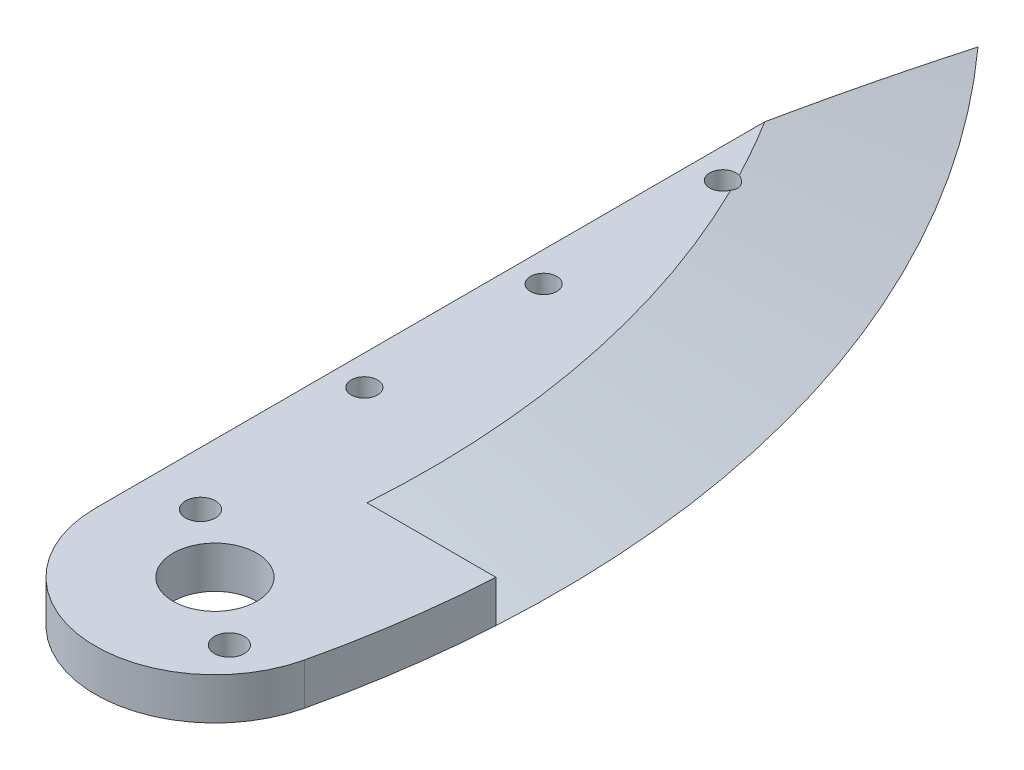
ISO-10303-21;
HEADER;
FILE_DESCRIPTION(('STEP AP214'),'2;1');
FILE_NAME('part.step','',(''),(''),'','','');
FILE_SCHEMA(('AUTOMOTIVE_DESIGN { 1 0 10303 214 1 1 1 1 }'));
ENDSEC;
DATA;
#1=APPLICATION_CONTEXT('core data for automotive mechanical design processes');
#2=APPLICATION_PROTOCOL_DEFINITION('international standard','automotive_design',2000,#1);
#3=PRODUCT_CONTEXT('',#1,'mechanical');
#4=PRODUCT('Part','Part','',(#3));
#5=PRODUCT_RELATED_PRODUCT_CATEGORY('part','',(#4));
#6=PRODUCT_DEFINITION_FORMATION('','',#4);
#7=PRODUCT_DEFINITION_CONTEXT('part definition',#1,'design');
#8=PRODUCT_DEFINITION('design','',#6,#7);
#9=PRODUCT_DEFINITION_SHAPE('','',#8);
#10=(LENGTH_UNIT() NAMED_UNIT(*) SI_UNIT(.MILLI.,.METRE.));
#11=(NAMED_UNIT(*) PLANE_ANGLE_UNIT() SI_UNIT($,.RADIAN.));
#12=(NAMED_UNIT(*) SI_UNIT($,.STERADIAN.) SOLID_ANGLE_UNIT());
#13=UNCERTAINTY_MEASURE_WITH_UNIT(LENGTH_MEASURE(1.E-05),#10,'distance_accuracy_value','');
#14=(GEOMETRIC_REPRESENTATION_CONTEXT(3) GLOBAL_UNCERTAINTY_ASSIGNED_CONTEXT((#13)) GLOBAL_UNIT_ASSIGNED_CONTEXT((#10,
#11,#12)) REPRESENTATION_CONTEXT('',''));
#15=CARTESIAN_POINT('',(0.,0.,0.));
#16=DIRECTION('',(0.,0.,1.));
#17=DIRECTION('',(1.,0.,0.));
#18=AXIS2_PLACEMENT_3D('',#15,#16,#17);
#19=CARTESIAN_POINT('',(-7.5,0.,-20.));
#20=DIRECTION('',(0.,1.,0.));
#21=DIRECTION('',(0.,0.,1.));
#22=AXIS2_PLACEMENT_3D('',#19,#20,#21);
#23=CYLINDRICAL_SURFACE('',#22,1.1);
#24=CARTESIAN_POINT('',(-7.5,0.,-20.));
#25=DIRECTION('',(0.,1.,0.));
#26=DIRECTION('',(0.,0.,1.));
#27=AXIS2_PLACEMENT_3D('',#24,#25,#26);
#28=CIRCLE('',#27,1.1);
#29=CARTESIAN_POINT('',(-7.5,0.,-18.9));
#30=VERTEX_POINT('',#29);
#31=EDGE_CURVE('E109',#30,#30,#28,.T.);
#32=ORIENTED_EDGE('',*,*,#31,.F.);
#33=EDGE_LOOP('',(#32));
#34=FACE_BOUND('',#33,.T.);
#35=CARTESIAN_POINT('',(-7.5,3.5,-20.));
#36=DIRECTION('',(0.,1.,0.));
#37=DIRECTION('',(0.,0.,1.));
#38=AXIS2_PLACEMENT_3D('',#35,#36,#37);
#39=CIRCLE('',#38,1.1);
#40=CARTESIAN_POINT('',(-7.5,3.5,-18.9));
#41=VERTEX_POINT('',#40);
#42=EDGE_CURVE('E148',#41,#41,#39,.T.);
#43=ORIENTED_EDGE('',*,*,#42,.T.);
#44=EDGE_LOOP('',(#43));
#45=FACE_BOUND('',#44,.T.);
#46=ADVANCED_FACE('F16',(#34,#45),#23,.F.);
#47=CARTESIAN_POINT('',(-7.5,0.,-35.));
#48=DIRECTION('',(0.,1.,0.));
#49=DIRECTION('',(0.,0.,1.));
#50=AXIS2_PLACEMENT_3D('',#47,#48,#49);
#51=CYLINDRICAL_SURFACE('',#50,1.1);
#52=CARTESIAN_POINT('',(-7.5,0.,-35.));
#53=DIRECTION('',(0.,1.,0.));
#54=DIRECTION('',(0.,0.,1.));
#55=AXIS2_PLACEMENT_3D('',#52,#53,#54);
#56=CIRCLE('',#55,1.1);
#57=CARTESIAN_POINT('',(-7.5,0.,-33.9));
#58=VERTEX_POINT('',#57);
#59=EDGE_CURVE('E170',#58,#58,#56,.T.);
#60=ORIENTED_EDGE('',*,*,#59,.F.);
#61=EDGE_LOOP('',(#60));
#62=FACE_BOUND('',#61,.T.);
#63=CARTESIAN_POINT('',(-7.5,3.5,-35.));
#64=DIRECTION('',(0.,1.,0.));
#65=DIRECTION('',(0.,0.,1.));
#66=AXIS2_PLACEMENT_3D('',#63,#64,#65);
#67=CIRCLE('',#66,1.1);
#68=CARTESIAN_POINT('',(-7.5,3.5,-33.9));
#69=VERTEX_POINT('',#68);
#70=EDGE_CURVE('E152',#69,#69,#67,.T.);
#71=ORIENTED_EDGE('',*,*,#70,.T.);
#72=EDGE_LOOP('',(#71));
#73=FACE_BOUND('',#72,.T.);
#74=ADVANCED_FACE('F220',(#62,#73),#51,.F.);
#75=CARTESIAN_POINT('',(-7.5,0.,-50.));
#76=DIRECTION('',(0.,1.,0.));
#77=DIRECTION('',(0.,0.,1.));
#78=AXIS2_PLACEMENT_3D('',#75,#76,#77);
#79=CYLINDRICAL_SURFACE('',#78,1.1);
#80=CARTESIAN_POINT('',(-6.46631187235693,3.49999999999992,-49.6238499571052));
#81=CARTESIAN_POINT('',(-6.45607062410141,3.49297877634061,-49.6519948755355));
#82=CARTESIAN_POINT('',(-6.44696231958127,3.48621857799535,-49.6806036607564));
#83=CARTESIAN_POINT('',(-6.43108839688875,3.47326332392636,-49.7385941021761));
#84=CARTESIAN_POINT('',(-6.42432319816683,3.46706836953566,-49.7679758957428));
#85=CARTESIAN_POINT('',(-6.40766510359482,3.44940252996874,-49.8570186176896));
#86=CARTESIAN_POINT('',(-6.40140466748316,3.4388472208493,-49.9175906902652));
#87=CARTESIAN_POINT('',(-6.39901507298767,3.42054524776643,-50.0394360130987));
#88=CARTESIAN_POINT('',(-6.40290193563018,3.41280304724679,-50.1007102199038));
#89=CARTESIAN_POINT('',(-6.42090033472022,3.40042385722411,-50.2220334059956));
#90=CARTESIAN_POINT('',(-6.43500460177031,3.39578466452872,-50.2820832251868));
#91=CARTESIAN_POINT('',(-6.47258785991137,3.38986229654186,-50.3975001179258));
#92=CARTESIAN_POINT('',(-6.4957963244886,3.38848971166973,-50.4529508311856));
#93=CARTESIAN_POINT('',(-6.55092410160917,3.38888698941554,-50.5593232948815));
#94=CARTESIAN_POINT('',(-6.58284270359912,3.39065659576542,-50.6102454143009));
#95=CARTESIAN_POINT('',(-6.65384420105782,3.39722098480096,-50.705325879994));
#96=CARTESIAN_POINT('',(-6.69280454351501,3.40196700458968,-50.7495792556829));
#97=CARTESIAN_POINT('',(-6.77705782729283,3.41427764176864,-50.8311417314869));
#98=CARTESIAN_POINT('',(-6.82235409683536,3.42184374403,-50.8684471577196));
#99=CARTESIAN_POINT('',(-6.91915588273286,3.43977642948853,-50.9360485484778));
#100=CARTESIAN_POINT('',(-6.97078759945537,3.45020785404511,-50.9661475773246));
#101=CARTESIAN_POINT('',(-7.05097066738159,3.46761854255056,-51.0046171503729));
#102=CARTESIAN_POINT('',(-7.07816203634793,3.47371792875002,-51.0163294548428));
#103=CARTESIAN_POINT('',(-7.1332818636862,3.48646103386444,-51.0374911988863));
#104=CARTESIAN_POINT('',(-7.1612101806697,3.49310464887283,-51.0469410690686));
#105=CARTESIAN_POINT('',(-7.1894267575076,3.49999999999993,-51.0552460665872));
#106=B_SPLINE_CURVE_WITH_KNOTS('',3,(#80,#81,#82,#83,#84,#85,#86,#87,#88,#89,#90,#91,#92,#93,
#94,#95,#96,#97,#98,#99,#100,#101,#102,#103,#104,#105),.UNSPECIFIED.,.F.,.F.,(4,2,2,2,2,2,2,2,2,
2,2,2,4),(0.,0.092235318165596,0.184487139287674,0.368946055930047,0.553696380936295,
0.738315390188104,0.917820005798431,1.09730998220209,1.27393353228807,1.45065021246979,
1.63175259158328,1.72235305391589,1.81293625854403),.UNSPECIFIED.);
#107=CARTESIAN_POINT('',(-6.466311872357,3.5,-49.623849957105));
#108=VERTEX_POINT('',#107);
#109=CARTESIAN_POINT('',(-7.18942675750774,3.5,-51.0552460665873));
#110=VERTEX_POINT('',#109);
#111=EDGE_CURVE('E19',#108,#110,#106,.T.);
#112=ORIENTED_EDGE('',*,*,#111,.T.);
#113=CARTESIAN_POINT('',(-7.5,3.5,-50.));
#114=DIRECTION('',(0.,1.,0.));
#115=DIRECTION('',(0.,0.,1.));
#116=AXIS2_PLACEMENT_3D('',#113,#114,#115);
#117=CIRCLE('',#116,1.1);
#118=EDGE_CURVE('E68',#110,#108,#117,.T.);
#119=ORIENTED_EDGE('',*,*,#118,.T.);
#120=EDGE_LOOP('',(#112,#119));
#121=FACE_BOUND('',#120,.T.);
#122=CARTESIAN_POINT('',(-7.5,0.,-50.));
#123=DIRECTION('',(0.,1.,0.));
#124=DIRECTION('',(0.,0.,1.));
#125=AXIS2_PLACEMENT_3D('',#122,#123,#124);
#126=CIRCLE('',#125,1.1);
#127=CARTESIAN_POINT('',(-7.5,0.,-48.9));
#128=VERTEX_POINT('',#127);
#129=EDGE_CURVE('E174',#128,#128,#126,.T.);
#130=ORIENTED_EDGE('',*,*,#129,.F.);
#131=EDGE_LOOP('',(#130));
#132=FACE_BOUND('',#131,.T.);
#133=ADVANCED_FACE('F223',(#121,#132),#79,.F.);
#134=CARTESIAN_POINT('',(0.,0.,0.));
#135=DIRECTION('',(0.,1.,0.));
#136=DIRECTION('',(0.,0.,1.));
#137=AXIS2_PLACEMENT_3D('',#134,#135,#136);
#138=CYLINDRICAL_SURFACE('',#137,3.5);
#139=CARTESIAN_POINT('',(0.,0.,0.));
#140=DIRECTION('',(0.,1.,0.));
#141=DIRECTION('',(0.,0.,1.));
#142=AXIS2_PLACEMENT_3D('',#139,#140,#141);
#143=CIRCLE('',#142,3.5);
#144=CARTESIAN_POINT('',(0.,0.,3.5));
#145=VERTEX_POINT('',#144);
#146=EDGE_CURVE('E31',#145,#145,#143,.T.);
#147=ORIENTED_EDGE('',*,*,#146,.F.);
#148=EDGE_LOOP('',(#147));
#149=FACE_BOUND('',#148,.T.);
#150=CARTESIAN_POINT('',(0.,3.5,0.));
#151=DIRECTION('',(0.,1.,0.));
#152=DIRECTION('',(0.,0.,1.));
#153=AXIS2_PLACEMENT_3D('',#150,#151,#152);
#154=CIRCLE('',#153,3.5);
#155=CARTESIAN_POINT('',(0.,3.5,3.5));
#156=VERTEX_POINT('',#155);
#157=EDGE_CURVE('E156',#156,#156,#154,.T.);
#158=ORIENTED_EDGE('',*,*,#157,.T.);
#159=EDGE_LOOP('',(#158));
#160=FACE_BOUND('',#159,.T.);
#161=ADVANCED_FACE('F234',(#149,#160),#138,.F.);
#162=CARTESIAN_POINT('',(0.,0.,-11.75));
#163=DIRECTION('',(0.,0.,1.));
#164=DIRECTION('',(1.,0.,0.));
#165=AXIS2_PLACEMENT_3D('',#162,#163,#164);
#166=PLANE('',#165);
#167=CARTESIAN_POINT('',(0.97347031211252,3.5,-11.75));
#168=CARTESIAN_POINT('',(4.57169122132087,2.33365314944628,-11.75));
#169=CARTESIAN_POINT('',(8.16979555651049,1.16694591150477,-11.75));
#170=CARTESIAN_POINT('',(11.76782244775,0.,-11.75));
#171=B_SPLINE_CURVE_WITH_KNOTS('',3,(#167,#168,#169,#170),.UNSPECIFIED.,.F.,.F.,(4,4),
(0.0347062337489441,0.0460538327237267),.UNSPECIFIED.);
#172=CARTESIAN_POINT('',(0.97347031211252,3.5,-11.75));
#173=VERTEX_POINT('',#172);
#174=CARTESIAN_POINT('',(11.76782244775,0.,-11.75));
#175=VERTEX_POINT('',#174);
#176=EDGE_CURVE('E192',#173,#175,#171,.T.);
#177=ORIENTED_EDGE('',*,*,#176,.F.);
#178=DIRECTION('',(1.,0.,0.));
#179=VECTOR('',#178,1.);
#180=CARTESIAN_POINT('',(0.,3.5,-11.75));
#181=LINE('',#180,#179);
#182=CARTESIAN_POINT('',(11.76782244775,3.5,-11.75));
#183=VERTEX_POINT('',#182);
#184=EDGE_CURVE('E83',#173,#183,#181,.T.);
#185=ORIENTED_EDGE('',*,*,#184,.T.);
#186=DIRECTION('',(0.,1.,0.));
#187=VECTOR('',#186,1.);
#188=CARTESIAN_POINT('',(11.76782244775,0.,-11.75));
#189=LINE('',#188,#187);
#190=EDGE_CURVE('E10',#175,#183,#189,.T.);
#191=ORIENTED_EDGE('',*,*,#190,.F.);
#192=EDGE_LOOP('',(#177,#185,#191));
#193=FACE_BOUND('',#192,.T.);
#194=ADVANCED_FACE('F226',(#193),#166,.F.);
#195=CARTESIAN_POINT('',(-73.0777548588926,0.,-16.8713290757901));
#196=DIRECTION('',(0.,1.,0.));
#197=DIRECTION('',(0.,0.,1.));
#198=AXIS2_PLACEMENT_3D('',#195,#196,#197);
#199=CYLINDRICAL_SURFACE('',#198,85.);
#200=CARTESIAN_POINT('',(-73.0777548588926,3.5,-16.8713290757901));
#201=DIRECTION('',(0.,1.,0.));
#202=DIRECTION('',(0.,0.,1.));
#203=AXIS2_PLACEMENT_3D('',#200,#201,#202);
#204=CIRCLE('',#203,85.);
#205=CARTESIAN_POINT('',(9.74370064785234,3.5,2.24951054343868));
#206=VERTEX_POINT('',#205);
#207=EDGE_CURVE('E115',#206,#183,#204,.T.);
#208=ORIENTED_EDGE('',*,*,#207,.F.);
#209=DIRECTION('',(0.,1.,0.));
#210=VECTOR('',#209,1.);
#211=CARTESIAN_POINT('',(9.74370064785234,0.,2.24951054343868));
#212=LINE('',#211,#210);
#213=CARTESIAN_POINT('',(9.74370064785234,0.,2.24951054343868));
#214=VERTEX_POINT('',#213);
#215=EDGE_CURVE('E113',#214,#206,#212,.T.);
#216=ORIENTED_EDGE('',*,*,#215,.F.);
#217=CARTESIAN_POINT('',(-73.0777548588926,0.,-16.8713290757901));
#218=DIRECTION('',(0.,1.,0.));
#219=DIRECTION('',(0.,0.,1.));
#220=AXIS2_PLACEMENT_3D('',#217,#218,#219);
#221=CIRCLE('',#220,85.);
#222=EDGE_CURVE('E99',#214,#175,#221,.T.);
#223=ORIENTED_EDGE('',*,*,#222,.T.);
#224=ORIENTED_EDGE('',*,*,#190,.T.);
#225=EDGE_LOOP('',(#208,#216,#223,#224));
#226=FACE_BOUND('',#225,.T.);
#227=ADVANCED_FACE('F114',(#226),#199,.T.);
#228=CARTESIAN_POINT('',(0.,0.,0.));
#229=DIRECTION('',(0.,1.,0.));
#230=DIRECTION('',(1.,0.,0.));
#231=AXIS2_PLACEMENT_3D('',#228,#229,#230);
#232=PLANE('',#231);
#233=CARTESIAN_POINT('',(5.51607527524703,0.,4.30963032727963));
#234=DIRECTION('',(0.,1.,0.));
#235=DIRECTION('',(0.,0.,1.));
#236=AXIS2_PLACEMENT_3D('',#233,#234,#235);
#237=CIRCLE('',#236,1.25);
#238=CARTESIAN_POINT('',(5.51607527524703,0.,5.55963032727963));
#239=VERTEX_POINT('',#238);
#240=EDGE_CURVE('E134',#239,#239,#237,.T.);
#241=ORIENTED_EDGE('',*,*,#240,.T.);
#242=EDGE_LOOP('',(#241));
#243=FACE_BOUND('',#242,.T.);
#244=CARTESIAN_POINT('',(-5.51607527524703,0.,-4.30963032727963));
#245=DIRECTION('',(0.,1.,0.));
#246=DIRECTION('',(0.,0.,1.));
#247=AXIS2_PLACEMENT_3D('',#244,#245,#246);
#248=CIRCLE('',#247,1.25);
#249=CARTESIAN_POINT('',(-5.51607527524703,0.,-3.05963032727963));
#250=VERTEX_POINT('',#249);
#251=EDGE_CURVE('E110',#250,#250,#248,.T.);
#252=ORIENTED_EDGE('',*,*,#251,.T.);
#253=EDGE_LOOP('',(#252));
#254=FACE_BOUND('',#253,.T.);
#255=ORIENTED_EDGE('',*,*,#146,.T.);
#256=EDGE_LOOP('',(#255));
#257=FACE_BOUND('',#256,.T.);
#258=ORIENTED_EDGE('',*,*,#129,.T.);
#259=EDGE_LOOP('',(#258));
#260=FACE_BOUND('',#259,.T.);
#261=ORIENTED_EDGE('',*,*,#59,.T.);
#262=EDGE_LOOP('',(#261));
#263=FACE_BOUND('',#262,.T.);
#264=ORIENTED_EDGE('',*,*,#31,.T.);
#265=EDGE_LOOP('',(#264));
#266=FACE_BOUND('',#265,.T.);
#267=DIRECTION('',(0.,0.,-1.));
#268=VECTOR('',#267,1.);
#269=CARTESIAN_POINT('',(-10.,0.,0.));
#270=LINE('',#269,#268);
#271=CARTESIAN_POINT('',(-10.,0.,0.));
#272=VERTEX_POINT('',#271);
#273=CARTESIAN_POINT('',(-9.99999999999999,0.,-73.8467346641793));
#274=VERTEX_POINT('',#273);
#275=EDGE_CURVE('E131',#272,#274,#270,.T.);
#276=ORIENTED_EDGE('',*,*,#275,.T.);
#277=CARTESIAN_POINT('',(-73.0777548588926,0.,-16.8713290757901));
#278=DIRECTION('',(0.,1.,0.));
#279=DIRECTION('',(0.,0.,1.));
#280=AXIS2_PLACEMENT_3D('',#277,#278,#279);
#281=CIRCLE('',#280,85.);
#282=EDGE_CURVE('E106',#175,#274,#281,.T.);
#283=ORIENTED_EDGE('',*,*,#282,.F.);
#284=ORIENTED_EDGE('',*,*,#222,.F.);
#285=CARTESIAN_POINT('',(0.,0.,0.));
#286=DIRECTION('',(0.,1.,0.));
#287=DIRECTION('',(0.,0.,1.));
#288=AXIS2_PLACEMENT_3D('',#285,#286,#287);
#289=CIRCLE('',#288,10.);
#290=EDGE_CURVE('E103',#272,#214,#289,.T.);
#291=ORIENTED_EDGE('',*,*,#290,.F.);
#292=EDGE_LOOP('',(#276,#283,#284,#291));
#293=FACE_BOUND('',#292,.T.);
#294=ADVANCED_FACE('F101',(#243,#254,#257,#260,#263,#266,#293),#232,.F.);
#295=CARTESIAN_POINT('',(-5.51607527524703,3.5,-4.30963032727963));
#296=DIRECTION('',(0.,-1.,0.));
#297=DIRECTION('',(0.,0.,-1.));
#298=AXIS2_PLACEMENT_3D('',#295,#296,#297);
#299=CYLINDRICAL_SURFACE('',#298,1.25);
#300=CARTESIAN_POINT('',(-5.51607527524703,3.5,-4.30963032727963));
#301=DIRECTION('',(0.,1.,0.));
#302=DIRECTION('',(0.,0.,1.));
#303=AXIS2_PLACEMENT_3D('',#300,#301,#302);
#304=CIRCLE('',#303,1.25);
#305=CARTESIAN_POINT('',(-5.51607527524703,3.5,-3.05963032727963));
#306=VERTEX_POINT('',#305);
#307=EDGE_CURVE('E160',#306,#306,#304,.T.);
#308=ORIENTED_EDGE('',*,*,#307,.T.);
#309=EDGE_LOOP('',(#308));
#310=FACE_BOUND('',#309,.T.);
#311=ORIENTED_EDGE('',*,*,#251,.F.);
#312=EDGE_LOOP('',(#311));
#313=FACE_BOUND('',#312,.T.);
#314=ADVANCED_FACE('F232',(#310,#313),#299,.F.);
#315=CARTESIAN_POINT('',(0.,3.5,0.));
#316=DIRECTION('',(0.,1.,0.));
#317=DIRECTION('',(1.,0.,0.));
#318=AXIS2_PLACEMENT_3D('',#315,#316,#317);
#319=PLANE('',#318);
#320=CARTESIAN_POINT('',(5.51607527524703,3.5,4.30963032727963));
#321=DIRECTION('',(0.,1.,0.));
#322=DIRECTION('',(0.,0.,1.));
#323=AXIS2_PLACEMENT_3D('',#320,#321,#322);
#324=CIRCLE('',#323,1.25);
#325=CARTESIAN_POINT('',(5.51607527524703,3.5,5.55963032727963));
#326=VERTEX_POINT('',#325);
#327=EDGE_CURVE('E138',#326,#326,#324,.T.);
#328=ORIENTED_EDGE('',*,*,#327,.F.);
#329=EDGE_LOOP('',(#328));
#330=FACE_BOUND('',#329,.T.);
#331=ORIENTED_EDGE('',*,*,#307,.F.);
#332=EDGE_LOOP('',(#331));
#333=FACE_BOUND('',#332,.T.);
#334=ORIENTED_EDGE('',*,*,#157,.F.);
#335=EDGE_LOOP('',(#334));
#336=FACE_BOUND('',#335,.T.);
#337=ORIENTED_EDGE('',*,*,#70,.F.);
#338=EDGE_LOOP('',(#337));
#339=FACE_BOUND('',#338,.T.);
#340=ORIENTED_EDGE('',*,*,#42,.F.);
#341=EDGE_LOOP('',(#340));
#342=FACE_BOUND('',#341,.T.);
#343=ORIENTED_EDGE('',*,*,#118,.F.);
#344=CARTESIAN_POINT('',(-73.0777548588926,3.5,-16.8713290757901));
#345=DIRECTION('',(0.,1.,0.));
#346=DIRECTION('',(0.,0.,1.));
#347=AXIS2_PLACEMENT_3D('',#344,#345,#346);
#348=CIRCLE('',#347,74.2281076198864);
#349=CARTESIAN_POINT('',(-9.99999999999999,3.5,-55.9994366557752));
#350=VERTEX_POINT('',#349);
#351=EDGE_CURVE('E184',#110,#350,#348,.T.);
#352=ORIENTED_EDGE('',*,*,#351,.T.);
#353=DIRECTION('',(0.,0.,-1.));
#354=VECTOR('',#353,1.);
#355=CARTESIAN_POINT('',(-10.,3.5,0.));
#356=LINE('',#355,#354);
#357=CARTESIAN_POINT('',(-10.,3.5,0.));
#358=VERTEX_POINT('',#357);
#359=EDGE_CURVE('E181',#358,#350,#356,.T.);
#360=ORIENTED_EDGE('',*,*,#359,.F.);
#361=CARTESIAN_POINT('',(0.,3.5,0.));
#362=DIRECTION('',(0.,1.,0.));
#363=DIRECTION('',(0.,0.,1.));
#364=AXIS2_PLACEMENT_3D('',#361,#362,#363);
#365=CIRCLE('',#364,10.);
#366=EDGE_CURVE('E119',#358,#206,#365,.T.);
#367=ORIENTED_EDGE('',*,*,#366,.T.);
#368=ORIENTED_EDGE('',*,*,#207,.T.);
#369=ORIENTED_EDGE('',*,*,#184,.F.);
#370=CARTESIAN_POINT('',(-73.0777548588926,3.5,-16.8713290757901));
#371=DIRECTION('',(0.,1.,0.));
#372=DIRECTION('',(0.,0.,1.));
#373=AXIS2_PLACEMENT_3D('',#370,#371,#372);
#374=CIRCLE('',#373,74.2281076198864);
#375=EDGE_CURVE('E195',#173,#108,#374,.T.);
#376=ORIENTED_EDGE('',*,*,#375,.T.);
#377=EDGE_LOOP('',(#343,#352,#360,#367,#368,#369,#376));
#378=FACE_BOUND('',#377,.T.);
#379=ADVANCED_FACE('F245',(#330,#333,#336,#339,#342,#378),#319,.T.);
#380=CARTESIAN_POINT('',(5.51607527524703,3.5,4.30963032727963));
#381=DIRECTION('',(0.,-1.,0.));
#382=DIRECTION('',(0.,0.,-1.));
#383=AXIS2_PLACEMENT_3D('',#380,#381,#382);
#384=CYLINDRICAL_SURFACE('',#383,1.25);
#385=ORIENTED_EDGE('',*,*,#240,.F.);
#386=EDGE_LOOP('',(#385));
#387=FACE_BOUND('',#386,.T.);
#388=ORIENTED_EDGE('',*,*,#327,.T.);
#389=EDGE_LOOP('',(#388));
#390=FACE_BOUND('',#389,.T.);
#391=ADVANCED_FACE('F247',(#387,#390),#384,.F.);
#392=CARTESIAN_POINT('',(0.,3.5,0.));
#393=DIRECTION('',(0.,-1.,0.));
#394=DIRECTION('',(0.,0.,-1.));
#395=AXIS2_PLACEMENT_3D('',#392,#393,#394);
#396=CYLINDRICAL_SURFACE('',#395,10.);
#397=ORIENTED_EDGE('',*,*,#290,.T.);
#398=ORIENTED_EDGE('',*,*,#215,.T.);
#399=ORIENTED_EDGE('',*,*,#366,.F.);
#400=DIRECTION('',(0.,-1.,0.));
#401=VECTOR('',#400,1.);
#402=CARTESIAN_POINT('',(-10.,3.5,0.));
#403=LINE('',#402,#401);
#404=EDGE_CURVE('E123',#358,#272,#403,.T.);
#405=ORIENTED_EDGE('',*,*,#404,.T.);
#406=EDGE_LOOP('',(#397,#398,#399,#405));
#407=FACE_BOUND('',#406,.T.);
#408=ADVANCED_FACE('F121',(#407),#396,.T.);
#409=CARTESIAN_POINT('',(-10.,3.5,0.));
#410=DIRECTION('',(-1.,0.,0.));
#411=DIRECTION('',(0.,0.,1.));
#412=AXIS2_PLACEMENT_3D('',#409,#410,#411);
#413=PLANE('',#412);
#414=ORIENTED_EDGE('',*,*,#359,.T.);
#415=CARTESIAN_POINT('',(-10.,3.49999999999999,-55.9994366557752));
#416=CARTESIAN_POINT('',(-10.,3.24407147972871,-57.4935356108701));
#417=CARTESIAN_POINT('',(-10.,2.97791301738732,-58.9858554355272));
#418=CARTESIAN_POINT('',(-10.,2.4271369469217,-61.9668960592866));
#419=CARTESIAN_POINT('',(-9.99999999999999,2.14252164977348,-63.4556172848494));
#420=CARTESIAN_POINT('',(-9.99999999999999,1.55677463736293,-66.4297580737208));
#421=CARTESIAN_POINT('',(-9.99999999999999,1.25564331355606,-67.9151777144146));
#422=CARTESIAN_POINT('',(-9.99999999999999,0.638527511321968,-70.8831249329819));
#423=CARTESIAN_POINT('',(-9.99999999999999,0.322541181983983,-72.3656521263649));
#424=CARTESIAN_POINT('',(-9.99999999999999,0.,-73.8467346641793));
#425=B_SPLINE_CURVE_WITH_KNOTS('',3,(#415,#416,#417,#418,#419,#420,#421,#422,#423,#424),
.UNSPECIFIED.,.F.,.F.,(4,2,2,2,4),(0.,4.5475060698971,9.09444384290995,13.6412738929756,
18.1886719803881),.UNSPECIFIED.);
#426=EDGE_CURVE('E187',#350,#274,#425,.T.);
#427=ORIENTED_EDGE('',*,*,#426,.T.);
#428=ORIENTED_EDGE('',*,*,#275,.F.);
#429=ORIENTED_EDGE('',*,*,#404,.F.);
#430=EDGE_LOOP('',(#414,#427,#428,#429));
#431=FACE_BOUND('',#430,.T.);
#432=ADVANCED_FACE('F211',(#431),#413,.T.);
#433=CARTESIAN_POINT('',(-73.0777548588926,3.5,-16.8713290757901));
#434=DIRECTION('',(0.,-1.,0.));
#435=DIRECTION('',(0.,0.,-1.));
#436=AXIS2_PLACEMENT_3D('',#433,#434,#435);
#437=CONICAL_SURFACE('',#436,74.2281076198864,1.25663706143592);
#438=ORIENTED_EDGE('',*,*,#111,.F.);
#439=ORIENTED_EDGE('',*,*,#375,.F.);
#440=ORIENTED_EDGE('',*,*,#176,.T.);
#441=ORIENTED_EDGE('',*,*,#282,.T.);
#442=ORIENTED_EDGE('',*,*,#426,.F.);
#443=ORIENTED_EDGE('',*,*,#351,.F.);
#444=EDGE_LOOP('',(#438,#439,#440,#441,#442,#443));
#445=FACE_BOUND('',#444,.T.);
#446=ADVANCED_FACE('F215',(#445),#437,.T.);
#447=CLOSED_SHELL('',(#46,#74,#133,#161,#194,#227,#294,#314,#379,#391,#408,#432,#446));
#448=MANIFOLD_SOLID_BREP('B1',#447);
#449=ADVANCED_BREP_SHAPE_REPRESENTATION('',(#18,#448),#14);
#450=SHAPE_DEFINITION_REPRESENTATION(#9,#449);
ENDSEC;
END-ISO-10303-21;
